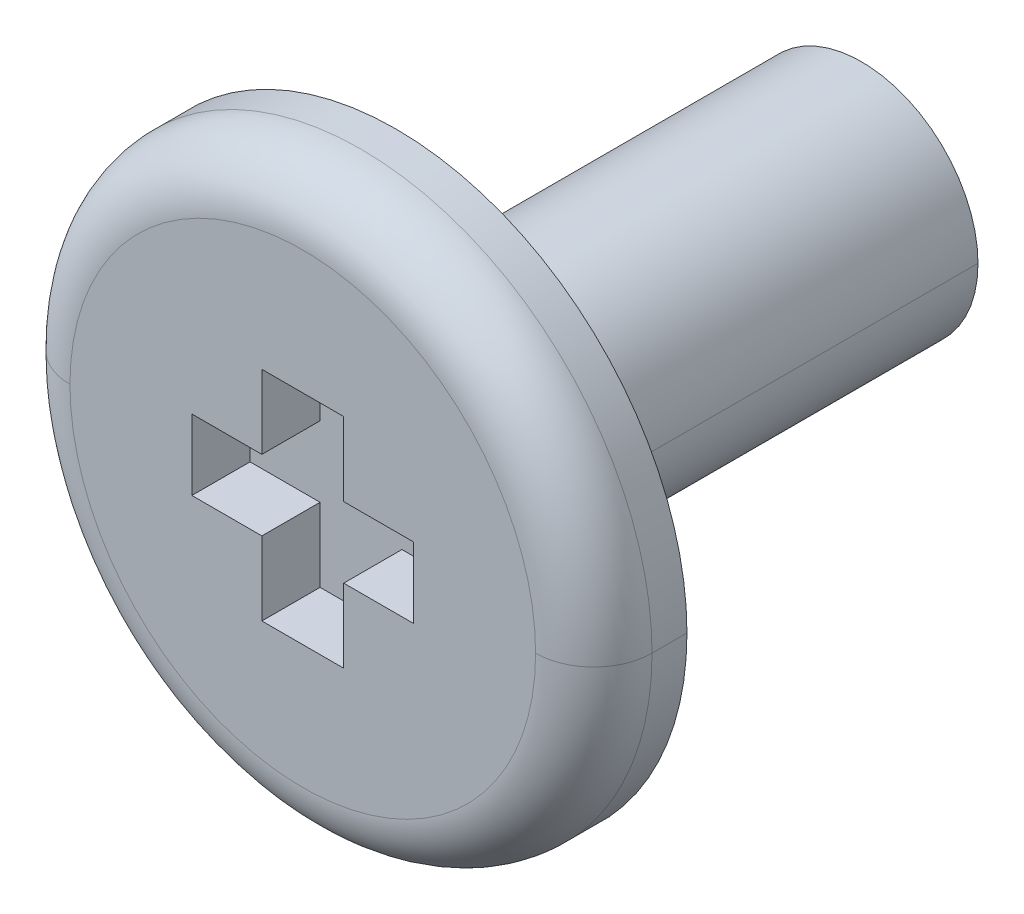
ISO-10303-21;
HEADER;
FILE_DESCRIPTION(('STEP AP214'),'2;1');
FILE_NAME('part.step','',(''),(''),'','','');
FILE_SCHEMA(('AUTOMOTIVE_DESIGN { 1 0 10303 214 1 1 1 1 }'));
ENDSEC;
DATA;
#1=APPLICATION_CONTEXT('core data for automotive mechanical design processes');
#2=APPLICATION_PROTOCOL_DEFINITION('international standard','automotive_design',2000,#1);
#3=PRODUCT_CONTEXT('',#1,'mechanical');
#4=PRODUCT('Part','Part','',(#3));
#5=PRODUCT_RELATED_PRODUCT_CATEGORY('part','',(#4));
#6=PRODUCT_DEFINITION_FORMATION('','',#4);
#7=PRODUCT_DEFINITION_CONTEXT('part definition',#1,'design');
#8=PRODUCT_DEFINITION('design','',#6,#7);
#9=PRODUCT_DEFINITION_SHAPE('','',#8);
#10=(LENGTH_UNIT() NAMED_UNIT(*) SI_UNIT(.MILLI.,.METRE.));
#11=(NAMED_UNIT(*) PLANE_ANGLE_UNIT() SI_UNIT($,.RADIAN.));
#12=(NAMED_UNIT(*) SI_UNIT($,.STERADIAN.) SOLID_ANGLE_UNIT());
#13=UNCERTAINTY_MEASURE_WITH_UNIT(LENGTH_MEASURE(1.E-05),#10,'distance_accuracy_value','');
#14=(GEOMETRIC_REPRESENTATION_CONTEXT(3) GLOBAL_UNCERTAINTY_ASSIGNED_CONTEXT((#13)) GLOBAL_UNIT_ASSIGNED_CONTEXT((#10,
#11,#12)) REPRESENTATION_CONTEXT('',''));
#15=CARTESIAN_POINT('',(0.,0.,0.));
#16=DIRECTION('',(0.,0.,1.));
#17=DIRECTION('',(1.,0.,0.));
#18=AXIS2_PLACEMENT_3D('',#15,#16,#17);
#19=CARTESIAN_POINT('',(0.,0.,0.3));
#20=DIRECTION('',(0.,0.,1.));
#21=DIRECTION('',(1.,0.,0.));
#22=AXIS2_PLACEMENT_3D('',#19,#20,#21);
#23=PLANE('',#22);
#24=DIRECTION('',(1.,0.,0.));
#25=VECTOR('',#24,1.);
#26=CARTESIAN_POINT('',(0.3515164959089,-0.3032036572768,0.3));
#27=LINE('',#26,#25);
#28=CARTESIAN_POINT('',(0.3515164959089,-0.3032036572768,0.3));
#29=VERTEX_POINT('',#28);
#30=CARTESIAN_POINT('',(0.9529257800133,-0.3032036572768,0.3));
#31=VERTEX_POINT('',#30);
#32=EDGE_CURVE('E11',#29,#31,#27,.T.);
#33=ORIENTED_EDGE('',*,*,#32,.T.);
#34=DIRECTION('',(0.,1.,0.));
#35=VECTOR('',#34,1.);
#36=CARTESIAN_POINT('',(0.9529257800133,-0.3032036572768,0.3));
#37=LINE('',#36,#35);
#38=CARTESIAN_POINT('',(0.9529257800133,0.3032036572768,0.3));
#39=VERTEX_POINT('',#38);
#40=EDGE_CURVE('E265',#31,#39,#37,.T.);
#41=ORIENTED_EDGE('',*,*,#40,.T.);
#42=DIRECTION('',(-1.,0.,0.));
#43=VECTOR('',#42,1.);
#44=CARTESIAN_POINT('',(0.9529257800133,0.3032036572768,0.3));
#45=LINE('',#44,#43);
#46=CARTESIAN_POINT('',(0.3515164959089,0.3032036572768,0.3));
#47=VERTEX_POINT('',#46);
#48=EDGE_CURVE('E239',#39,#47,#45,.T.);
#49=ORIENTED_EDGE('',*,*,#48,.T.);
#50=DIRECTION('',(0.,1.,0.));
#51=VECTOR('',#50,1.);
#52=CARTESIAN_POINT('',(0.3515164959089,0.3032036572768,0.3));
#53=LINE('',#52,#51);
#54=CARTESIAN_POINT('',(0.3515164959089,0.936181688084,0.3));
#55=VERTEX_POINT('',#54);
#56=EDGE_CURVE('E237',#47,#55,#53,.T.);
#57=ORIENTED_EDGE('',*,*,#56,.T.);
#58=DIRECTION('',(-1.,0.,0.));
#59=VECTOR('',#58,1.);
#60=CARTESIAN_POINT('',(0.3515164959089,0.936181688084,0.3));
#61=LINE('',#60,#59);
#62=CARTESIAN_POINT('',(-0.351516495909,0.936181688084,0.3));
#63=VERTEX_POINT('',#62);
#64=EDGE_CURVE('E379',#55,#63,#61,.T.);
#65=ORIENTED_EDGE('',*,*,#64,.T.);
#66=DIRECTION('',(0.,-1.,0.));
#67=VECTOR('',#66,1.);
#68=CARTESIAN_POINT('',(-0.351516495909,0.936181688084,0.3));
#69=LINE('',#68,#67);
#70=CARTESIAN_POINT('',(-0.351516495909,0.3032036572768,0.3));
#71=VERTEX_POINT('',#70);
#72=EDGE_CURVE('E258',#63,#71,#69,.T.);
#73=ORIENTED_EDGE('',*,*,#72,.T.);
#74=DIRECTION('',(-1.,0.,0.));
#75=VECTOR('',#74,1.);
#76=CARTESIAN_POINT('',(-0.351516495909,0.3032036572768,0.3));
#77=LINE('',#76,#75);
#78=CARTESIAN_POINT('',(-0.9529257800133,0.3032036572768,0.3));
#79=VERTEX_POINT('',#78);
#80=EDGE_CURVE('E270',#71,#79,#77,.T.);
#81=ORIENTED_EDGE('',*,*,#80,.T.);
#82=DIRECTION('',(0.,-1.,0.));
#83=VECTOR('',#82,1.);
#84=CARTESIAN_POINT('',(-0.9529257800133,0.3032036572768,0.3));
#85=LINE('',#84,#83);
#86=CARTESIAN_POINT('',(-0.9529257800133,-0.3032036572768,0.3));
#87=VERTEX_POINT('',#86);
#88=EDGE_CURVE('E256',#79,#87,#85,.T.);
#89=ORIENTED_EDGE('',*,*,#88,.T.);
#90=DIRECTION('',(1.,0.,0.));
#91=VECTOR('',#90,1.);
#92=CARTESIAN_POINT('',(-0.9529257800133,-0.3032036572768,0.3));
#93=LINE('',#92,#91);
#94=CARTESIAN_POINT('',(-0.351516495909,-0.3032036572768,0.3));
#95=VERTEX_POINT('',#94);
#96=EDGE_CURVE('E257',#87,#95,#93,.T.);
#97=ORIENTED_EDGE('',*,*,#96,.T.);
#98=DIRECTION('',(0.,-1.,0.));
#99=VECTOR('',#98,1.);
#100=CARTESIAN_POINT('',(-0.351516495909,-0.3032036572768,0.3));
#101=LINE('',#100,#99);
#102=CARTESIAN_POINT('',(-0.351516495909,-0.936181688084,0.3));
#103=VERTEX_POINT('',#102);
#104=EDGE_CURVE('E363',#95,#103,#101,.T.);
#105=ORIENTED_EDGE('',*,*,#104,.T.);
#106=DIRECTION('',(1.,0.,0.));
#107=VECTOR('',#106,1.);
#108=CARTESIAN_POINT('',(-0.351516495909,-0.936181688084,0.3));
#109=LINE('',#108,#107);
#110=CARTESIAN_POINT('',(0.3515164959089,-0.936181688084,0.3));
#111=VERTEX_POINT('',#110);
#112=EDGE_CURVE('E275',#103,#111,#109,.T.);
#113=ORIENTED_EDGE('',*,*,#112,.T.);
#114=DIRECTION('',(0.,1.,0.));
#115=VECTOR('',#114,1.);
#116=CARTESIAN_POINT('',(0.3515164959089,-0.936181688084,0.3));
#117=LINE('',#116,#115);
#118=EDGE_CURVE('E266',#111,#29,#117,.T.);
#119=ORIENTED_EDGE('',*,*,#118,.T.);
#120=EDGE_LOOP('',(#33,#41,#49,#57,#65,#73,#81,#89,#97,#105,#113,#119));
#121=FACE_BOUND('',#120,.T.);
#122=ADVANCED_FACE('F17',(#121),#23,.T.);
#123=CARTESIAN_POINT('',(0.3515164959089,-0.3032036572768,0.8));
#124=DIRECTION('',(0.,-1.,0.));
#125=DIRECTION('',(0.,0.,-1.));
#126=AXIS2_PLACEMENT_3D('',#123,#124,#125);
#127=PLANE('',#126);
#128=DIRECTION('',(0.,0.,-1.));
#129=VECTOR('',#128,1.);
#130=CARTESIAN_POINT('',(0.9529257800133,-0.3032036572768,0.8));
#131=LINE('',#130,#129);
#132=CARTESIAN_POINT('',(0.9529257800133,-0.3032036572768,0.8));
#133=VERTEX_POINT('',#132);
#134=EDGE_CURVE('E28',#133,#31,#131,.T.);
#135=ORIENTED_EDGE('',*,*,#134,.T.);
#136=ORIENTED_EDGE('',*,*,#32,.F.);
#137=DIRECTION('',(0.,0.,-1.));
#138=VECTOR('',#137,1.);
#139=CARTESIAN_POINT('',(0.3515164959089,-0.3032036572768,0.8));
#140=LINE('',#139,#138);
#141=CARTESIAN_POINT('',(0.3515164959089,-0.3032036572768,0.8));
#142=VERTEX_POINT('',#141);
#143=EDGE_CURVE('E150',#142,#29,#140,.T.);
#144=ORIENTED_EDGE('',*,*,#143,.F.);
#145=DIRECTION('',(1.,0.,0.));
#146=VECTOR('',#145,1.);
#147=CARTESIAN_POINT('',(0.3515164959089,-0.3032036572768,0.8));
#148=LINE('',#147,#146);
#149=EDGE_CURVE('E249',#142,#133,#148,.T.);
#150=ORIENTED_EDGE('',*,*,#149,.T.);
#151=EDGE_LOOP('',(#135,#136,#144,#150));
#152=FACE_BOUND('',#151,.T.);
#153=ADVANCED_FACE('F491',(#152),#127,.F.);
#154=CARTESIAN_POINT('',(0.9529257800133,-0.3032036572768,0.8));
#155=DIRECTION('',(1.,0.,0.));
#156=DIRECTION('',(0.,1.,0.));
#157=AXIS2_PLACEMENT_3D('',#154,#155,#156);
#158=PLANE('',#157);
#159=DIRECTION('',(0.,0.,-1.));
#160=VECTOR('',#159,1.);
#161=CARTESIAN_POINT('',(0.9529257800133,0.3032036572768,0.8));
#162=LINE('',#161,#160);
#163=CARTESIAN_POINT('',(0.9529257800133,0.3032036572768,0.8));
#164=VERTEX_POINT('',#163);
#165=EDGE_CURVE('E83',#164,#39,#162,.T.);
#166=ORIENTED_EDGE('',*,*,#165,.T.);
#167=ORIENTED_EDGE('',*,*,#40,.F.);
#168=ORIENTED_EDGE('',*,*,#134,.F.);
#169=DIRECTION('',(0.,1.,0.));
#170=VECTOR('',#169,1.);
#171=CARTESIAN_POINT('',(0.9529257800133,-0.3032036572768,0.8));
#172=LINE('',#171,#170);
#173=EDGE_CURVE('E356',#133,#164,#172,.T.);
#174=ORIENTED_EDGE('',*,*,#173,.T.);
#175=EDGE_LOOP('',(#166,#167,#168,#174));
#176=FACE_BOUND('',#175,.T.);
#177=ADVANCED_FACE('F393',(#176),#158,.F.);
#178=CARTESIAN_POINT('',(0.9529257800133,0.3032036572768,0.8));
#179=DIRECTION('',(0.,1.,0.));
#180=DIRECTION('',(1.,0.,0.));
#181=AXIS2_PLACEMENT_3D('',#178,#179,#180);
#182=PLANE('',#181);
#183=DIRECTION('',(0.,0.,-1.));
#184=VECTOR('',#183,1.);
#185=CARTESIAN_POINT('',(0.3515164959089,0.3032036572768,0.8));
#186=LINE('',#185,#184);
#187=CARTESIAN_POINT('',(0.3515164959089,0.3032036572768,0.8));
#188=VERTEX_POINT('',#187);
#189=EDGE_CURVE('E97',#188,#47,#186,.T.);
#190=ORIENTED_EDGE('',*,*,#189,.T.);
#191=ORIENTED_EDGE('',*,*,#48,.F.);
#192=ORIENTED_EDGE('',*,*,#165,.F.);
#193=DIRECTION('',(-1.,0.,0.));
#194=VECTOR('',#193,1.);
#195=CARTESIAN_POINT('',(0.9529257800133,0.3032036572768,0.8));
#196=LINE('',#195,#194);
#197=EDGE_CURVE('E322',#164,#188,#196,.T.);
#198=ORIENTED_EDGE('',*,*,#197,.T.);
#199=EDGE_LOOP('',(#190,#191,#192,#198));
#200=FACE_BOUND('',#199,.T.);
#201=ADVANCED_FACE('F396',(#200),#182,.F.);
#202=CARTESIAN_POINT('',(0.3515164959089,0.3032036572768,0.8));
#203=DIRECTION('',(1.,0.,0.));
#204=DIRECTION('',(0.,1.,0.));
#205=AXIS2_PLACEMENT_3D('',#202,#203,#204);
#206=PLANE('',#205);
#207=DIRECTION('',(0.,0.,-1.));
#208=VECTOR('',#207,1.);
#209=CARTESIAN_POINT('',(0.3515164959089,0.936181688084,0.8));
#210=LINE('',#209,#208);
#211=CARTESIAN_POINT('',(0.3515164959089,0.936181688084,0.8));
#212=VERTEX_POINT('',#211);
#213=EDGE_CURVE('E109',#212,#55,#210,.T.);
#214=ORIENTED_EDGE('',*,*,#213,.T.);
#215=ORIENTED_EDGE('',*,*,#56,.F.);
#216=ORIENTED_EDGE('',*,*,#189,.F.);
#217=DIRECTION('',(0.,1.,0.));
#218=VECTOR('',#217,1.);
#219=CARTESIAN_POINT('',(0.3515164959089,0.3032036572768,0.8));
#220=LINE('',#219,#218);
#221=EDGE_CURVE('E315',#188,#212,#220,.T.);
#222=ORIENTED_EDGE('',*,*,#221,.T.);
#223=EDGE_LOOP('',(#214,#215,#216,#222));
#224=FACE_BOUND('',#223,.T.);
#225=ADVANCED_FACE('F398',(#224),#206,.F.);
#226=CARTESIAN_POINT('',(0.3515164959089,0.936181688084,0.8));
#227=DIRECTION('',(0.,1.,0.));
#228=DIRECTION('',(1.,0.,0.));
#229=AXIS2_PLACEMENT_3D('',#226,#227,#228);
#230=PLANE('',#229);
#231=DIRECTION('',(0.,0.,-1.));
#232=VECTOR('',#231,1.);
#233=CARTESIAN_POINT('',(-0.351516495909,0.936181688084,0.8));
#234=LINE('',#233,#232);
#235=CARTESIAN_POINT('',(-0.351516495909,0.936181688084,0.8));
#236=VERTEX_POINT('',#235);
#237=EDGE_CURVE('E261',#236,#63,#234,.T.);
#238=ORIENTED_EDGE('',*,*,#237,.T.);
#239=ORIENTED_EDGE('',*,*,#64,.F.);
#240=ORIENTED_EDGE('',*,*,#213,.F.);
#241=DIRECTION('',(-1.,0.,0.));
#242=VECTOR('',#241,1.);
#243=CARTESIAN_POINT('',(0.3515164959089,0.936181688084,0.8));
#244=LINE('',#243,#242);
#245=EDGE_CURVE('E313',#212,#236,#244,.T.);
#246=ORIENTED_EDGE('',*,*,#245,.T.);
#247=EDGE_LOOP('',(#238,#239,#240,#246));
#248=FACE_BOUND('',#247,.T.);
#249=ADVANCED_FACE('F402',(#248),#230,.F.);
#250=CARTESIAN_POINT('',(-0.351516495909,0.936181688084,0.8));
#251=DIRECTION('',(-1.,0.,0.));
#252=DIRECTION('',(0.,0.,1.));
#253=AXIS2_PLACEMENT_3D('',#250,#251,#252);
#254=PLANE('',#253);
#255=DIRECTION('',(0.,0.,-1.));
#256=VECTOR('',#255,1.);
#257=CARTESIAN_POINT('',(-0.351516495909,0.3032036572768,0.8));
#258=LINE('',#257,#256);
#259=CARTESIAN_POINT('',(-0.351516495909,0.3032036572768,0.8));
#260=VERTEX_POINT('',#259);
#261=EDGE_CURVE('E262',#260,#71,#258,.T.);
#262=ORIENTED_EDGE('',*,*,#261,.T.);
#263=ORIENTED_EDGE('',*,*,#72,.F.);
#264=ORIENTED_EDGE('',*,*,#237,.F.);
#265=DIRECTION('',(0.,-1.,0.));
#266=VECTOR('',#265,1.);
#267=CARTESIAN_POINT('',(-0.351516495909,0.936181688084,0.8));
#268=LINE('',#267,#266);
#269=EDGE_CURVE('E302',#236,#260,#268,.T.);
#270=ORIENTED_EDGE('',*,*,#269,.T.);
#271=EDGE_LOOP('',(#262,#263,#264,#270));
#272=FACE_BOUND('',#271,.T.);
#273=ADVANCED_FACE('F403',(#272),#254,.F.);
#274=CARTESIAN_POINT('',(-0.351516495909,0.3032036572768,0.8));
#275=DIRECTION('',(0.,1.,0.));
#276=DIRECTION('',(1.,0.,0.));
#277=AXIS2_PLACEMENT_3D('',#274,#275,#276);
#278=PLANE('',#277);
#279=DIRECTION('',(0.,0.,-1.));
#280=VECTOR('',#279,1.);
#281=CARTESIAN_POINT('',(-0.9529257800133,0.3032036572768,0.8));
#282=LINE('',#281,#280);
#283=CARTESIAN_POINT('',(-0.9529257800133,0.3032036572768,0.8));
#284=VERTEX_POINT('',#283);
#285=EDGE_CURVE('E274',#284,#79,#282,.T.);
#286=ORIENTED_EDGE('',*,*,#285,.T.);
#287=ORIENTED_EDGE('',*,*,#80,.F.);
#288=ORIENTED_EDGE('',*,*,#261,.F.);
#289=DIRECTION('',(-1.,0.,0.));
#290=VECTOR('',#289,1.);
#291=CARTESIAN_POINT('',(-0.351516495909,0.3032036572768,0.8));
#292=LINE('',#291,#290);
#293=EDGE_CURVE('E325',#260,#284,#292,.T.);
#294=ORIENTED_EDGE('',*,*,#293,.T.);
#295=EDGE_LOOP('',(#286,#287,#288,#294));
#296=FACE_BOUND('',#295,.T.);
#297=ADVANCED_FACE('F19',(#296),#278,.F.);
#298=CARTESIAN_POINT('',(-0.9529257800133,0.3032036572768,0.8));
#299=DIRECTION('',(-1.,0.,0.));
#300=DIRECTION('',(0.,0.,1.));
#301=AXIS2_PLACEMENT_3D('',#298,#299,#300);
#302=PLANE('',#301);
#303=DIRECTION('',(0.,0.,-1.));
#304=VECTOR('',#303,1.);
#305=CARTESIAN_POINT('',(-0.9529257800133,-0.3032036572768,0.8));
#306=LINE('',#305,#304);
#307=CARTESIAN_POINT('',(-0.9529257800133,-0.3032036572768,0.8));
#308=VERTEX_POINT('',#307);
#309=EDGE_CURVE('E252',#308,#87,#306,.T.);
#310=ORIENTED_EDGE('',*,*,#309,.T.);
#311=ORIENTED_EDGE('',*,*,#88,.F.);
#312=ORIENTED_EDGE('',*,*,#285,.F.);
#313=DIRECTION('',(0.,-1.,0.));
#314=VECTOR('',#313,1.);
#315=CARTESIAN_POINT('',(-0.9529257800133,0.3032036572768,0.8));
#316=LINE('',#315,#314);
#317=EDGE_CURVE('E334',#284,#308,#316,.T.);
#318=ORIENTED_EDGE('',*,*,#317,.T.);
#319=EDGE_LOOP('',(#310,#311,#312,#318));
#320=FACE_BOUND('',#319,.T.);
#321=ADVANCED_FACE('F415',(#320),#302,.F.);
#322=CARTESIAN_POINT('',(-0.9529257800133,-0.3032036572768,0.8));
#323=DIRECTION('',(0.,-1.,0.));
#324=DIRECTION('',(0.,0.,-1.));
#325=AXIS2_PLACEMENT_3D('',#322,#323,#324);
#326=PLANE('',#325);
#327=DIRECTION('',(0.,0.,-1.));
#328=VECTOR('',#327,1.);
#329=CARTESIAN_POINT('',(-0.351516495909,-0.3032036572768,0.8));
#330=LINE('',#329,#328);
#331=CARTESIAN_POINT('',(-0.351516495909,-0.3032036572768,0.8));
#332=VERTEX_POINT('',#331);
#333=EDGE_CURVE('E347',#332,#95,#330,.T.);
#334=ORIENTED_EDGE('',*,*,#333,.T.);
#335=ORIENTED_EDGE('',*,*,#96,.F.);
#336=ORIENTED_EDGE('',*,*,#309,.F.);
#337=DIRECTION('',(1.,0.,0.));
#338=VECTOR('',#337,1.);
#339=CARTESIAN_POINT('',(-0.9529257800133,-0.3032036572768,0.8));
#340=LINE('',#339,#338);
#341=EDGE_CURVE('E344',#308,#332,#340,.T.);
#342=ORIENTED_EDGE('',*,*,#341,.T.);
#343=EDGE_LOOP('',(#334,#335,#336,#342));
#344=FACE_BOUND('',#343,.T.);
#345=ADVANCED_FACE('F433',(#344),#326,.F.);
#346=CARTESIAN_POINT('',(-0.351516495909,-0.3032036572768,0.8));
#347=DIRECTION('',(-1.,0.,0.));
#348=DIRECTION('',(0.,0.,1.));
#349=AXIS2_PLACEMENT_3D('',#346,#347,#348);
#350=PLANE('',#349);
#351=DIRECTION('',(0.,0.,-1.));
#352=VECTOR('',#351,1.);
#353=CARTESIAN_POINT('',(-0.351516495909,-0.936181688084,0.8));
#354=LINE('',#353,#352);
#355=CARTESIAN_POINT('',(-0.351516495909,-0.936181688084,0.8));
#356=VERTEX_POINT('',#355);
#357=EDGE_CURVE('E195',#356,#103,#354,.T.);
#358=ORIENTED_EDGE('',*,*,#357,.T.);
#359=ORIENTED_EDGE('',*,*,#104,.F.);
#360=ORIENTED_EDGE('',*,*,#333,.F.);
#361=DIRECTION('',(0.,-1.,0.));
#362=VECTOR('',#361,1.);
#363=CARTESIAN_POINT('',(-0.351516495909,-0.3032036572768,0.8));
#364=LINE('',#363,#362);
#365=EDGE_CURVE('E351',#332,#356,#364,.T.);
#366=ORIENTED_EDGE('',*,*,#365,.T.);
#367=EDGE_LOOP('',(#358,#359,#360,#366));
#368=FACE_BOUND('',#367,.T.);
#369=ADVANCED_FACE('F442',(#368),#350,.F.);
#370=CARTESIAN_POINT('',(-0.351516495909,-0.936181688084,0.8));
#371=DIRECTION('',(0.,-1.,0.));
#372=DIRECTION('',(0.,0.,-1.));
#373=AXIS2_PLACEMENT_3D('',#370,#371,#372);
#374=PLANE('',#373);
#375=DIRECTION('',(0.,0.,-1.));
#376=VECTOR('',#375,1.);
#377=CARTESIAN_POINT('',(0.3515164959089,-0.936181688084,0.8));
#378=LINE('',#377,#376);
#379=CARTESIAN_POINT('',(0.3515164959089,-0.936181688084,0.8));
#380=VERTEX_POINT('',#379);
#381=EDGE_CURVE('E269',#380,#111,#378,.T.);
#382=ORIENTED_EDGE('',*,*,#381,.T.);
#383=ORIENTED_EDGE('',*,*,#112,.F.);
#384=ORIENTED_EDGE('',*,*,#357,.F.);
#385=DIRECTION('',(1.,0.,0.));
#386=VECTOR('',#385,1.);
#387=CARTESIAN_POINT('',(-0.351516495909,-0.936181688084,0.8));
#388=LINE('',#387,#386);
#389=EDGE_CURVE('E213',#356,#380,#388,.T.);
#390=ORIENTED_EDGE('',*,*,#389,.T.);
#391=EDGE_LOOP('',(#382,#383,#384,#390));
#392=FACE_BOUND('',#391,.T.);
#393=ADVANCED_FACE('F454',(#392),#374,.F.);
#394=CARTESIAN_POINT('',(0.3515164959089,-0.936181688084,0.8));
#395=DIRECTION('',(1.,0.,0.));
#396=DIRECTION('',(0.,1.,0.));
#397=AXIS2_PLACEMENT_3D('',#394,#395,#396);
#398=PLANE('',#397);
#399=ORIENTED_EDGE('',*,*,#143,.T.);
#400=ORIENTED_EDGE('',*,*,#118,.F.);
#401=ORIENTED_EDGE('',*,*,#381,.F.);
#402=DIRECTION('',(0.,1.,0.));
#403=VECTOR('',#402,1.);
#404=CARTESIAN_POINT('',(0.3515164959089,-0.936181688084,0.8));
#405=LINE('',#404,#403);
#406=EDGE_CURVE('E245',#380,#142,#405,.T.);
#407=ORIENTED_EDGE('',*,*,#406,.T.);
#408=EDGE_LOOP('',(#399,#400,#401,#407));
#409=FACE_BOUND('',#408,.T.);
#410=ADVANCED_FACE('F448',(#409),#398,.F.);
#411=CARTESIAN_POINT('',(0.,0.,1.04));
#412=DIRECTION('',(0.,0.,-1.));
#413=DIRECTION('',(1.,0.,0.));
#414=AXIS2_PLACEMENT_3D('',#411,#412,#413);
#415=CYLINDRICAL_SURFACE('',#414,2.5);
#416=DIRECTION('',(0.,-2.631587512543E-13,1.));
#417=VECTOR('',#416,1.);
#418=CARTESIAN_POINT('',(2.5,0.,0.));
#419=LINE('',#418,#417);
#420=CARTESIAN_POINT('',(2.5,0.,0.));
#421=VERTEX_POINT('',#420);
#422=CARTESIAN_POINT('',(2.5,0.,0.3));
#423=VERTEX_POINT('',#422);
#424=EDGE_CURVE('E244',#421,#423,#419,.T.);
#425=ORIENTED_EDGE('',*,*,#424,.F.);
#426=CARTESIAN_POINT('',(0.,0.,0.));
#427=DIRECTION('',(0.,0.,-1.));
#428=DIRECTION('',(-1.,0.,0.));
#429=AXIS2_PLACEMENT_3D('',#426,#427,#428);
#430=CIRCLE('',#429,2.5);
#431=CARTESIAN_POINT('',(-2.5,0.,0.));
#432=VERTEX_POINT('',#431);
#433=EDGE_CURVE('E312',#432,#421,#430,.T.);
#434=ORIENTED_EDGE('',*,*,#433,.F.);
#435=DIRECTION('',(0.,2.638519320047E-13,1.));
#436=VECTOR('',#435,1.);
#437=CARTESIAN_POINT('',(-2.5,0.,0.));
#438=LINE('',#437,#436);
#439=CARTESIAN_POINT('',(-2.5,0.,0.3));
#440=VERTEX_POINT('',#439);
#441=EDGE_CURVE('E304',#432,#440,#438,.T.);
#442=ORIENTED_EDGE('',*,*,#441,.T.);
#443=CARTESIAN_POINT('',(0.,0.,0.3));
#444=DIRECTION('',(0.,0.,1.));
#445=DIRECTION('',(1.,0.,0.));
#446=AXIS2_PLACEMENT_3D('',#443,#444,#445);
#447=CIRCLE('',#446,2.5);
#448=EDGE_CURVE('E248',#423,#440,#447,.T.);
#449=ORIENTED_EDGE('',*,*,#448,.F.);
#450=EDGE_LOOP('',(#425,#434,#442,#449));
#451=FACE_BOUND('',#450,.T.);
#452=ADVANCED_FACE('F453',(#451),#415,.T.);
#453=CARTESIAN_POINT('',(0.,0.,0.3));
#454=DIRECTION('',(0.,0.,-1.));
#455=DIRECTION('',(0.99996807614082,-0.00799041295724916,0.));
#456=AXIS2_PLACEMENT_3D('',#453,#454,#455);
#457=TOROIDAL_SURFACE('',#456,2.,0.5);
#458=CARTESIAN_POINT('',(2.,-5.034202221754E-13,0.3));
#459=DIRECTION('',(2.517083763642E-13,1.,0.));
#460=DIRECTION('',(0.,0.,1.));
#461=AXIS2_PLACEMENT_3D('',#458,#459,#460);
#462=CIRCLE('',#461,0.5);
#463=CARTESIAN_POINT('',(2.,0.,0.8));
#464=VERTEX_POINT('',#463);
#465=EDGE_CURVE('E206',#464,#423,#462,.T.);
#466=ORIENTED_EDGE('',*,*,#465,.T.);
#467=ORIENTED_EDGE('',*,*,#448,.T.);
#468=CARTESIAN_POINT('',(-2.,5.027402105728E-13,0.3));
#469=DIRECTION('',(-2.513683705629E-13,-1.,0.));
#470=DIRECTION('',(0.,0.,1.));
#471=AXIS2_PLACEMENT_3D('',#468,#469,#470);
#472=CIRCLE('',#471,0.5);
#473=CARTESIAN_POINT('',(-2.,0.,0.8));
#474=VERTEX_POINT('',#473);
#475=EDGE_CURVE('E209',#474,#440,#472,.T.);
#476=ORIENTED_EDGE('',*,*,#475,.F.);
#477=CARTESIAN_POINT('',(0.,0.,0.8));
#478=DIRECTION('',(0.,0.,1.));
#479=DIRECTION('',(1.,0.,0.));
#480=AXIS2_PLACEMENT_3D('',#477,#478,#479);
#481=CIRCLE('',#480,2.);
#482=EDGE_CURVE('E202',#464,#474,#481,.T.);
#483=ORIENTED_EDGE('',*,*,#482,.F.);
#484=EDGE_LOOP('',(#466,#467,#476,#483));
#485=FACE_BOUND('',#484,.T.);
#486=ADVANCED_FACE('F204',(#485),#457,.T.);
#487=CARTESIAN_POINT('',(0.,0.,0.8));
#488=DIRECTION('',(0.,0.,-1.));
#489=DIRECTION('',(0.,-1.,0.));
#490=AXIS2_PLACEMENT_3D('',#487,#488,#489);
#491=PLANE('',#490);
#492=ORIENTED_EDGE('',*,*,#389,.F.);
#493=ORIENTED_EDGE('',*,*,#365,.F.);
#494=ORIENTED_EDGE('',*,*,#341,.F.);
#495=ORIENTED_EDGE('',*,*,#317,.F.);
#496=ORIENTED_EDGE('',*,*,#293,.F.);
#497=ORIENTED_EDGE('',*,*,#269,.F.);
#498=ORIENTED_EDGE('',*,*,#245,.F.);
#499=ORIENTED_EDGE('',*,*,#221,.F.);
#500=ORIENTED_EDGE('',*,*,#197,.F.);
#501=ORIENTED_EDGE('',*,*,#173,.F.);
#502=ORIENTED_EDGE('',*,*,#149,.F.);
#503=ORIENTED_EDGE('',*,*,#406,.F.);
#504=EDGE_LOOP('',(#492,#493,#494,#495,#496,#497,#498,#499,#500,#501,#502,#503));
#505=FACE_BOUND('',#504,.T.);
#506=ORIENTED_EDGE('',*,*,#482,.T.);
#507=CARTESIAN_POINT('',(0.,0.,0.8));
#508=DIRECTION('',(0.,0.,1.));
#509=DIRECTION('',(-1.,0.,0.));
#510=AXIS2_PLACEMENT_3D('',#507,#508,#509);
#511=CIRCLE('',#510,2.);
#512=EDGE_CURVE('E214',#474,#464,#511,.T.);
#513=ORIENTED_EDGE('',*,*,#512,.T.);
#514=EDGE_LOOP('',(#506,#513));
#515=FACE_BOUND('',#514,.T.);
#516=ADVANCED_FACE('F216',(#505,#515),#491,.F.);
#517=CARTESIAN_POINT('',(0.,0.,0.3));
#518=DIRECTION('',(0.,0.,-1.));
#519=DIRECTION('',(-0.99996807614082,0.00799041295724916,0.));
#520=AXIS2_PLACEMENT_3D('',#517,#518,#519);
#521=TOROIDAL_SURFACE('',#520,2.,0.5);
#522=ORIENTED_EDGE('',*,*,#475,.T.);
#523=CARTESIAN_POINT('',(0.,0.,0.3));
#524=DIRECTION('',(0.,0.,1.));
#525=DIRECTION('',(-1.,0.,0.));
#526=AXIS2_PLACEMENT_3D('',#523,#524,#525);
#527=CIRCLE('',#526,2.5);
#528=EDGE_CURVE('E222',#440,#423,#527,.T.);
#529=ORIENTED_EDGE('',*,*,#528,.T.);
#530=ORIENTED_EDGE('',*,*,#465,.F.);
#531=ORIENTED_EDGE('',*,*,#512,.F.);
#532=EDGE_LOOP('',(#522,#529,#530,#531));
#533=FACE_BOUND('',#532,.T.);
#534=ADVANCED_FACE('F220',(#533),#521,.T.);
#535=CARTESIAN_POINT('',(0.,0.,1.04));
#536=DIRECTION('',(0.,0.,-1.));
#537=DIRECTION('',(1.,0.,0.));
#538=AXIS2_PLACEMENT_3D('',#535,#536,#537);
#539=CYLINDRICAL_SURFACE('',#538,2.5);
#540=ORIENTED_EDGE('',*,*,#441,.F.);
#541=CARTESIAN_POINT('',(0.,0.,0.));
#542=DIRECTION('',(0.,0.,1.));
#543=DIRECTION('',(-1.,0.,0.));
#544=AXIS2_PLACEMENT_3D('',#541,#542,#543);
#545=CIRCLE('',#544,2.5);
#546=EDGE_CURVE('E307',#432,#421,#545,.T.);
#547=ORIENTED_EDGE('',*,*,#546,.T.);
#548=ORIENTED_EDGE('',*,*,#424,.T.);
#549=ORIENTED_EDGE('',*,*,#528,.F.);
#550=EDGE_LOOP('',(#540,#547,#548,#549));
#551=FACE_BOUND('',#550,.T.);
#552=ADVANCED_FACE('F425',(#551),#539,.T.);
#553=CARTESIAN_POINT('',(0.,0.,0.));
#554=DIRECTION('',(0.,0.,-1.));
#555=DIRECTION('',(0.,-1.,0.));
#556=AXIS2_PLACEMENT_3D('',#553,#554,#555);
#557=PLANE('',#556);
#558=CARTESIAN_POINT('',(0.,0.,0.));
#559=DIRECTION('',(0.,0.,1.));
#560=DIRECTION('',(-1.,0.,0.));
#561=AXIS2_PLACEMENT_3D('',#558,#559,#560);
#562=CIRCLE('',#561,1.);
#563=CARTESIAN_POINT('',(-1.,0.,0.));
#564=VERTEX_POINT('',#563);
#565=CARTESIAN_POINT('',(1.,0.,0.));
#566=VERTEX_POINT('',#565);
#567=EDGE_CURVE('E278',#564,#566,#562,.T.);
#568=ORIENTED_EDGE('',*,*,#567,.T.);
#569=CARTESIAN_POINT('',(0.,0.,0.));
#570=DIRECTION('',(0.,0.,-1.));
#571=DIRECTION('',(-1.,0.,0.));
#572=AXIS2_PLACEMENT_3D('',#569,#570,#571);
#573=CIRCLE('',#572,1.);
#574=EDGE_CURVE('E372',#564,#566,#573,.T.);
#575=ORIENTED_EDGE('',*,*,#574,.F.);
#576=EDGE_LOOP('',(#568,#575));
#577=FACE_BOUND('',#576,.T.);
#578=ORIENTED_EDGE('',*,*,#433,.T.);
#579=ORIENTED_EDGE('',*,*,#546,.F.);
#580=EDGE_LOOP('',(#578,#579));
#581=FACE_BOUND('',#580,.T.);
#582=ADVANCED_FACE('F473',(#577,#581),#557,.T.);
#583=CARTESIAN_POINT('',(0.,0.,1.04));
#584=DIRECTION('',(0.,0.,-1.));
#585=DIRECTION('',(1.,0.,0.));
#586=AXIS2_PLACEMENT_3D('',#583,#584,#585);
#587=CYLINDRICAL_SURFACE('',#586,1.);
#588=ORIENTED_EDGE('',*,*,#574,.T.);
#589=DIRECTION('',(0.,0.,1.));
#590=VECTOR('',#589,1.);
#591=CARTESIAN_POINT('',(1.,0.,-4.));
#592=LINE('',#591,#590);
#593=CARTESIAN_POINT('',(1.,0.,-4.));
#594=VERTEX_POINT('',#593);
#595=EDGE_CURVE('E235',#594,#566,#592,.T.);
#596=ORIENTED_EDGE('',*,*,#595,.F.);
#597=CARTESIAN_POINT('',(0.,0.,-4.));
#598=DIRECTION('',(0.,0.,-1.));
#599=DIRECTION('',(-1.,0.,0.));
#600=AXIS2_PLACEMENT_3D('',#597,#598,#599);
#601=CIRCLE('',#600,1.);
#602=CARTESIAN_POINT('',(-1.,0.,-4.));
#603=VERTEX_POINT('',#602);
#604=EDGE_CURVE('E284',#603,#594,#601,.T.);
#605=ORIENTED_EDGE('',*,*,#604,.F.);
#606=DIRECTION('',(0.,0.,1.));
#607=VECTOR('',#606,1.);
#608=CARTESIAN_POINT('',(-1.,0.,-4.));
#609=LINE('',#608,#607);
#610=EDGE_CURVE('E21',#603,#564,#609,.T.);
#611=ORIENTED_EDGE('',*,*,#610,.T.);
#612=EDGE_LOOP('',(#588,#596,#605,#611));
#613=FACE_BOUND('',#612,.T.);
#614=ADVANCED_FACE('F467',(#613),#587,.T.);
#615=CARTESIAN_POINT('',(0.,0.,1.04));
#616=DIRECTION('',(0.,0.,-1.));
#617=DIRECTION('',(1.,0.,0.));
#618=AXIS2_PLACEMENT_3D('',#615,#616,#617);
#619=CYLINDRICAL_SURFACE('',#618,1.);
#620=CARTESIAN_POINT('',(0.,0.,-4.));
#621=DIRECTION('',(0.,0.,1.));
#622=DIRECTION('',(-1.,0.,0.));
#623=AXIS2_PLACEMENT_3D('',#620,#621,#622);
#624=CIRCLE('',#623,1.);
#625=EDGE_CURVE('E281',#603,#594,#624,.T.);
#626=ORIENTED_EDGE('',*,*,#625,.T.);
#627=ORIENTED_EDGE('',*,*,#595,.T.);
#628=ORIENTED_EDGE('',*,*,#567,.F.);
#629=ORIENTED_EDGE('',*,*,#610,.F.);
#630=EDGE_LOOP('',(#626,#627,#628,#629));
#631=FACE_BOUND('',#630,.T.);
#632=ADVANCED_FACE('F461',(#631),#619,.T.);
#633=CARTESIAN_POINT('',(0.,0.,-4.));
#634=DIRECTION('',(0.,0.,-1.));
#635=DIRECTION('',(0.,-1.,0.));
#636=AXIS2_PLACEMENT_3D('',#633,#634,#635);
#637=PLANE('',#636);
#638=ORIENTED_EDGE('',*,*,#604,.T.);
#639=ORIENTED_EDGE('',*,*,#625,.F.);
#640=EDGE_LOOP('',(#638,#639));
#641=FACE_BOUND('',#640,.T.);
#642=ADVANCED_FACE('F466',(#641),#637,.T.);
#643=CLOSED_SHELL('',(#122,#153,#177,#201,#225,#249,#273,#297,#321,#345,#369,#393,#410,#452,
#486,#516,#534,#552,#582,#614,#632,#642));
#644=MANIFOLD_SOLID_BREP('B1',#643);
#645=ADVANCED_BREP_SHAPE_REPRESENTATION('',(#18,#644),#14);
#646=SHAPE_DEFINITION_REPRESENTATION(#9,#645);
ENDSEC;
END-ISO-10303-21;
